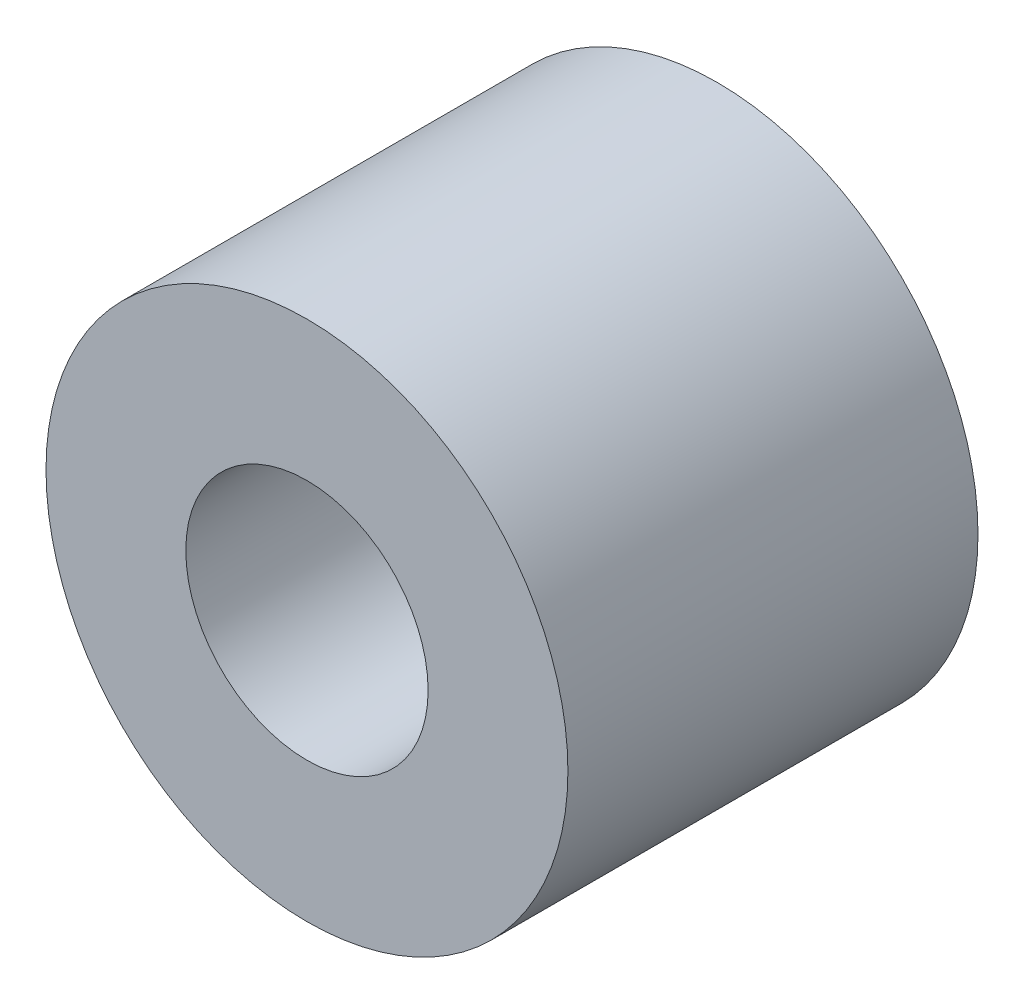
ISO-10303-21;
HEADER;
FILE_DESCRIPTION(('STEP AP214'),'2;1');
FILE_NAME('part.step','',(''),(''),'','','');
FILE_SCHEMA(('AUTOMOTIVE_DESIGN { 1 0 10303 214 1 1 1 1 }'));
ENDSEC;
DATA;
#1=APPLICATION_CONTEXT('core data for automotive mechanical design processes');
#2=APPLICATION_PROTOCOL_DEFINITION('international standard','automotive_design',2000,#1);
#3=PRODUCT_CONTEXT('',#1,'mechanical');
#4=PRODUCT('Part','Part','',(#3));
#5=PRODUCT_RELATED_PRODUCT_CATEGORY('part','',(#4));
#6=PRODUCT_DEFINITION_FORMATION('','',#4);
#7=PRODUCT_DEFINITION_CONTEXT('part definition',#1,'design');
#8=PRODUCT_DEFINITION('design','',#6,#7);
#9=PRODUCT_DEFINITION_SHAPE('','',#8);
#10=(LENGTH_UNIT() NAMED_UNIT(*) SI_UNIT(.MILLI.,.METRE.));
#11=(NAMED_UNIT(*) PLANE_ANGLE_UNIT() SI_UNIT($,.RADIAN.));
#12=(NAMED_UNIT(*) SI_UNIT($,.STERADIAN.) SOLID_ANGLE_UNIT());
#13=UNCERTAINTY_MEASURE_WITH_UNIT(LENGTH_MEASURE(1.E-05),#10,'distance_accuracy_value','');
#14=(GEOMETRIC_REPRESENTATION_CONTEXT(3) GLOBAL_UNCERTAINTY_ASSIGNED_CONTEXT((#13)) GLOBAL_UNIT_ASSIGNED_CONTEXT((#10,
#11,#12)) REPRESENTATION_CONTEXT('',''));
#15=CARTESIAN_POINT('',(0.,0.,0.));
#16=DIRECTION('',(0.,0.,1.));
#17=DIRECTION('',(1.,0.,0.));
#18=AXIS2_PLACEMENT_3D('',#15,#16,#17);
#19=CARTESIAN_POINT('',(0.,0.,11.));
#20=DIRECTION('',(0.,0.,1.));
#21=DIRECTION('',(1.,0.,0.));
#22=AXIS2_PLACEMENT_3D('',#19,#20,#21);
#23=PLANE('',#22);
#24=CARTESIAN_POINT('',(0.,0.,11.));
#25=DIRECTION('',(0.,0.,1.));
#26=DIRECTION('',(1.,0.,0.));
#27=AXIS2_PLACEMENT_3D('',#24,#25,#26);
#28=CIRCLE('',#27,7.);
#29=CARTESIAN_POINT('',(7.,0.,11.));
#30=VERTEX_POINT('',#29);
#31=EDGE_CURVE('E10',#30,#30,#28,.T.);
#32=ORIENTED_EDGE('',*,*,#31,.T.);
#33=EDGE_LOOP('',(#32));
#34=FACE_BOUND('',#33,.T.);
#35=CARTESIAN_POINT('',(0.,0.,11.));
#36=DIRECTION('',(0.,0.,1.));
#37=DIRECTION('',(1.,0.,0.));
#38=AXIS2_PLACEMENT_3D('',#35,#36,#37);
#39=CIRCLE('',#38,3.25);
#40=CARTESIAN_POINT('',(3.25,0.,11.));
#41=VERTEX_POINT('',#40);
#42=EDGE_CURVE('E50',#41,#41,#39,.T.);
#43=ORIENTED_EDGE('',*,*,#42,.F.);
#44=EDGE_LOOP('',(#43));
#45=FACE_BOUND('',#44,.T.);
#46=ADVANCED_FACE('F37',(#34,#45),#23,.T.);
#47=CARTESIAN_POINT('',(0.,0.,0.));
#48=DIRECTION('',(0.,0.,1.));
#49=DIRECTION('',(1.,0.,0.));
#50=AXIS2_PLACEMENT_3D('',#47,#48,#49);
#51=PLANE('',#50);
#52=CARTESIAN_POINT('',(0.,0.,0.));
#53=DIRECTION('',(0.,0.,1.));
#54=DIRECTION('',(1.,0.,0.));
#55=AXIS2_PLACEMENT_3D('',#52,#53,#54);
#56=CIRCLE('',#55,7.);
#57=CARTESIAN_POINT('',(7.,0.,0.));
#58=VERTEX_POINT('',#57);
#59=EDGE_CURVE('E41',#58,#58,#56,.T.);
#60=ORIENTED_EDGE('',*,*,#59,.F.);
#61=EDGE_LOOP('',(#60));
#62=FACE_BOUND('',#61,.T.);
#63=CARTESIAN_POINT('',(0.,0.,0.));
#64=DIRECTION('',(0.,0.,1.));
#65=DIRECTION('',(1.,0.,0.));
#66=AXIS2_PLACEMENT_3D('',#63,#64,#65);
#67=CIRCLE('',#66,3.25);
#68=CARTESIAN_POINT('',(3.25,0.,0.));
#69=VERTEX_POINT('',#68);
#70=EDGE_CURVE('E52',#69,#69,#67,.T.);
#71=ORIENTED_EDGE('',*,*,#70,.T.);
#72=EDGE_LOOP('',(#71));
#73=FACE_BOUND('',#72,.T.);
#74=ADVANCED_FACE('F64',(#62,#73),#51,.F.);
#75=CARTESIAN_POINT('',(0.,0.,11.));
#76=DIRECTION('',(0.,0.,-1.));
#77=DIRECTION('',(-1.,0.,0.));
#78=AXIS2_PLACEMENT_3D('',#75,#76,#77);
#79=CYLINDRICAL_SURFACE('',#78,7.);
#80=ORIENTED_EDGE('',*,*,#31,.F.);
#81=EDGE_LOOP('',(#80));
#82=FACE_BOUND('',#81,.T.);
#83=ORIENTED_EDGE('',*,*,#59,.T.);
#84=EDGE_LOOP('',(#83));
#85=FACE_BOUND('',#84,.T.);
#86=ADVANCED_FACE('F39',(#82,#85),#79,.T.);
#87=CARTESIAN_POINT('',(0.,0.,11.));
#88=DIRECTION('',(0.,0.,-1.));
#89=DIRECTION('',(-1.,0.,0.));
#90=AXIS2_PLACEMENT_3D('',#87,#88,#89);
#91=CYLINDRICAL_SURFACE('',#90,3.25);
#92=ORIENTED_EDGE('',*,*,#42,.T.);
#93=EDGE_LOOP('',(#92));
#94=FACE_BOUND('',#93,.T.);
#95=ORIENTED_EDGE('',*,*,#70,.F.);
#96=EDGE_LOOP('',(#95));
#97=FACE_BOUND('',#96,.T.);
#98=ADVANCED_FACE('F60',(#94,#97),#91,.F.);
#99=CLOSED_SHELL('',(#46,#74,#86,#98));
#100=MANIFOLD_SOLID_BREP('B2',#99);
#101=ADVANCED_BREP_SHAPE_REPRESENTATION('',(#18,#100),#14);
#102=SHAPE_DEFINITION_REPRESENTATION(#9,#101);
ENDSEC;
END-ISO-10303-21;
